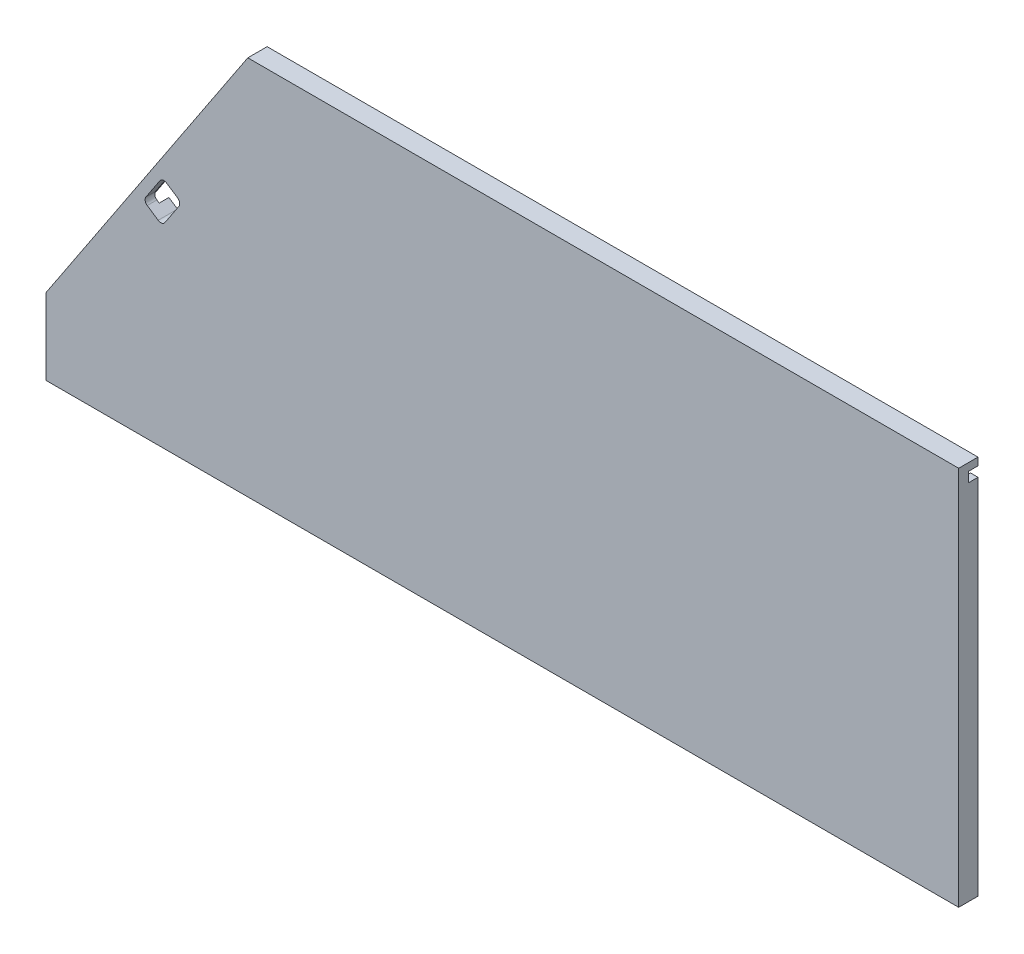
ISO-10303-21;
HEADER;
FILE_DESCRIPTION(('STEP AP214'),'2;1');
FILE_NAME('part.step','',(''),(''),'','','');
FILE_SCHEMA(('AUTOMOTIVE_DESIGN { 1 0 10303 214 1 1 1 1 }'));
ENDSEC;
DATA;
#1=APPLICATION_CONTEXT('core data for automotive mechanical design processes');
#2=APPLICATION_PROTOCOL_DEFINITION('international standard','automotive_design',2000,#1);
#3=PRODUCT_CONTEXT('',#1,'mechanical');
#4=PRODUCT('Part','Part','',(#3));
#5=PRODUCT_RELATED_PRODUCT_CATEGORY('part','',(#4));
#6=PRODUCT_DEFINITION_FORMATION('','',#4);
#7=PRODUCT_DEFINITION_CONTEXT('part definition',#1,'design');
#8=PRODUCT_DEFINITION('design','',#6,#7);
#9=PRODUCT_DEFINITION_SHAPE('','',#8);
#10=(LENGTH_UNIT() NAMED_UNIT(*) SI_UNIT(.MILLI.,.METRE.));
#11=(NAMED_UNIT(*) PLANE_ANGLE_UNIT() SI_UNIT($,.RADIAN.));
#12=(NAMED_UNIT(*) SI_UNIT($,.STERADIAN.) SOLID_ANGLE_UNIT());
#13=UNCERTAINTY_MEASURE_WITH_UNIT(LENGTH_MEASURE(1.E-05),#10,'distance_accuracy_value','');
#14=(GEOMETRIC_REPRESENTATION_CONTEXT(3) GLOBAL_UNCERTAINTY_ASSIGNED_CONTEXT((#13)) GLOBAL_UNIT_ASSIGNED_CONTEXT((#10,
#11,#12)) REPRESENTATION_CONTEXT('',''));
#15=CARTESIAN_POINT('',(0.,0.,0.));
#16=DIRECTION('',(0.,0.,1.));
#17=DIRECTION('',(1.,0.,0.));
#18=AXIS2_PLACEMENT_3D('',#15,#16,#17);
#19=CARTESIAN_POINT('',(-385.693130461073,212.808045977011,6.35));
#20=DIRECTION('',(0.833333333333333,-0.552770798392567,0.));
#21=DIRECTION('',(0.552770798392567,0.833333333333333,0.));
#22=AXIS2_PLACEMENT_3D('',#19,#20,#21);
#23=PLANE('',#22);
#24=DIRECTION('',(-0.552770798392567,-0.833333333333333,0.));
#25=VECTOR('',#24,1.);
#26=CARTESIAN_POINT('',(-385.693130461073,212.808045977011,6.35));
#27=LINE('',#26,#25);
#28=CARTESIAN_POINT('',(-456.447792655321,106.141379310345,6.35));
#29=VERTEX_POINT('',#28);
#30=CARTESIAN_POINT('',(-513.029885057471,20.8406655143671,6.35));
#31=VERTEX_POINT('',#30);
#32=EDGE_CURVE('E271',#29,#31,#27,.T.);
#33=ORIENTED_EDGE('',*,*,#32,.F.);
#34=DIRECTION('',(0.,0.,-1.));
#35=VECTOR('',#34,1.);
#36=CARTESIAN_POINT('',(-456.447792655321,106.141379310345,6.35));
#37=LINE('',#36,#35);
#38=CARTESIAN_POINT('',(-456.447792655321,106.141379310345,0.));
#39=VERTEX_POINT('',#38);
#40=EDGE_CURVE('E261',#29,#39,#37,.T.);
#41=ORIENTED_EDGE('',*,*,#40,.T.);
#42=DIRECTION('',(-0.552770798392567,-0.833333333333333,0.));
#43=VECTOR('',#42,1.);
#44=CARTESIAN_POINT('',(-385.693130461073,212.808045977011,0.));
#45=LINE('',#44,#43);
#46=CARTESIAN_POINT('',(-513.029885057471,20.8406655143671,0.));
#47=VERTEX_POINT('',#46);
#48=EDGE_CURVE('E266',#39,#47,#45,.T.);
#49=ORIENTED_EDGE('',*,*,#48,.T.);
#50=DIRECTION('',(0.,0.,-1.));
#51=VECTOR('',#50,1.);
#52=CARTESIAN_POINT('',(-513.029885057471,20.8406655143671,6.35));
#53=LINE('',#52,#51);
#54=EDGE_CURVE('E303',#31,#47,#53,.T.);
#55=ORIENTED_EDGE('',*,*,#54,.F.);
#56=EDGE_LOOP('',(#33,#41,#49,#55));
#57=FACE_BOUND('',#56,.T.);
#58=ADVANCED_FACE('F32',(#57),#23,.F.);
#59=CARTESIAN_POINT('',(0.,0.,0.));
#60=DIRECTION('',(0.,0.,1.));
#61=DIRECTION('',(1.,0.,0.));
#62=AXIS2_PLACEMENT_3D('',#59,#60,#61);
#63=PLANE('',#62);
#64=DIRECTION('',(0.,1.,0.));
#65=VECTOR('',#64,1.);
#66=CARTESIAN_POINT('',(75.4701149425288,-25.6919540229885,0.));
#67=LINE('',#66,#65);
#68=CARTESIAN_POINT('',(75.4701149425288,219.308045977011,0.));
#69=VERTEX_POINT('',#68);
#70=CARTESIAN_POINT('',(75.4701149425288,224.308045977011,0.));
#71=VERTEX_POINT('',#70);
#72=EDGE_CURVE('E358',#69,#71,#67,.T.);
#73=ORIENTED_EDGE('',*,*,#72,.F.);
#74=DIRECTION('',(-1.,0.,0.));
#75=VECTOR('',#74,1.);
#76=CARTESIAN_POINT('',(70.4701149425288,219.308045977011,0.));
#77=LINE('',#76,#75);
#78=CARTESIAN_POINT('',(-389.181518233611,219.308045977011,0.));
#79=VERTEX_POINT('',#78);
#80=EDGE_CURVE('E311',#69,#79,#77,.T.);
#81=ORIENTED_EDGE('',*,*,#80,.T.);
#82=DIRECTION('',(-0.552770798392567,-0.833333333333333,0.));
#83=VECTOR('',#82,1.);
#84=CARTESIAN_POINT('',(-389.181518233611,219.308045977011,0.));
#85=LINE('',#84,#83);
#86=CARTESIAN_POINT('',(-519.529885057471,22.8004892541227,0.));
#87=VERTEX_POINT('',#86);
#88=EDGE_CURVE('E306',#79,#87,#85,.T.);
#89=ORIENTED_EDGE('',*,*,#88,.T.);
#90=DIRECTION('',(0.,-1.,0.));
#91=VECTOR('',#90,1.);
#92=CARTESIAN_POINT('',(-519.529885057471,22.8004892541227,0.));
#93=LINE('',#92,#91);
#94=CARTESIAN_POINT('',(-519.529885057471,-20.6919540229885,0.));
#95=VERTEX_POINT('',#94);
#96=EDGE_CURVE('E321',#87,#95,#93,.T.);
#97=ORIENTED_EDGE('',*,*,#96,.T.);
#98=DIRECTION('',(1.,0.,0.));
#99=VECTOR('',#98,1.);
#100=CARTESIAN_POINT('',(-519.529885057471,-20.6919540229885,0.));
#101=LINE('',#100,#99);
#102=CARTESIAN_POINT('',(70.4701149425288,-20.6919540229885,0.));
#103=VERTEX_POINT('',#102);
#104=EDGE_CURVE('E324',#95,#103,#101,.T.);
#105=ORIENTED_EDGE('',*,*,#104,.T.);
#106=DIRECTION('',(0.,1.,0.));
#107=VECTOR('',#106,1.);
#108=CARTESIAN_POINT('',(70.4701149425288,-20.6919540229885,0.));
#109=LINE('',#108,#107);
#110=CARTESIAN_POINT('',(70.4701149425288,212.808045977011,0.));
#111=VERTEX_POINT('',#110);
#112=EDGE_CURVE('E327',#103,#111,#109,.T.);
#113=ORIENTED_EDGE('',*,*,#112,.T.);
#114=DIRECTION('',(-1.,0.,0.));
#115=VECTOR('',#114,1.);
#116=CARTESIAN_POINT('',(-19.1346419276526,212.808045977011,0.));
#117=LINE('',#116,#115);
#118=CARTESIAN_POINT('',(75.4701149425288,212.808045977011,0.));
#119=VERTEX_POINT('',#118);
#120=EDGE_CURVE('E47',#119,#111,#117,.T.);
#121=ORIENTED_EDGE('',*,*,#120,.F.);
#122=CARTESIAN_POINT('',(75.4701149425288,-25.6919540229885,0.));
#123=VERTEX_POINT('',#122);
#124=EDGE_CURVE('E233',#123,#119,#67,.T.);
#125=ORIENTED_EDGE('',*,*,#124,.F.);
#126=DIRECTION('',(1.,0.,0.));
#127=VECTOR('',#126,1.);
#128=CARTESIAN_POINT('',(-524.529885057471,-25.6919540229885,0.));
#129=LINE('',#128,#127);
#130=CARTESIAN_POINT('',(-524.529885057471,-25.6919540229885,0.));
#131=VERTEX_POINT('',#130);
#132=EDGE_CURVE('E356',#131,#123,#129,.T.);
#133=ORIENTED_EDGE('',*,*,#132,.F.);
#134=DIRECTION('',(0.,-1.,0.));
#135=VECTOR('',#134,1.);
#136=CARTESIAN_POINT('',(-524.529885057471,24.3080459770115,0.));
#137=LINE('',#136,#135);
#138=CARTESIAN_POINT('',(-524.529885057471,24.3080459770115,0.));
#139=VERTEX_POINT('',#138);
#140=EDGE_CURVE('E340',#139,#131,#137,.T.);
#141=ORIENTED_EDGE('',*,*,#140,.F.);
#142=DIRECTION('',(-0.552770798392567,-0.833333333333333,0.));
#143=VECTOR('',#142,1.);
#144=CARTESIAN_POINT('',(-391.864893443255,224.308045977011,0.));
#145=LINE('',#144,#143);
#146=CARTESIAN_POINT('',(-391.864893443255,224.308045977011,0.));
#147=VERTEX_POINT('',#146);
#148=EDGE_CURVE('E345',#147,#139,#145,.T.);
#149=ORIENTED_EDGE('',*,*,#148,.F.);
#150=DIRECTION('',(-1.,0.,0.));
#151=VECTOR('',#150,1.);
#152=CARTESIAN_POINT('',(75.4701149425288,224.308045977011,0.));
#153=LINE('',#152,#151);
#154=EDGE_CURVE('E360',#71,#147,#153,.T.);
#155=ORIENTED_EDGE('',*,*,#154,.F.);
#156=EDGE_LOOP('',(#73,#81,#89,#97,#105,#113,#121,#125,#133,#141,#149,#155));
#157=FACE_BOUND('',#156,.T.);
#158=ADVANCED_FACE('F491',(#157),#63,.F.);
#159=CARTESIAN_POINT('',(-524.529885057471,24.3080459770115,12.7));
#160=DIRECTION('',(1.,0.,0.));
#161=DIRECTION('',(0.,0.,-1.));
#162=AXIS2_PLACEMENT_3D('',#159,#160,#161);
#163=PLANE('',#162);
#164=ORIENTED_EDGE('',*,*,#140,.T.);
#165=DIRECTION('',(0.,0.,-1.));
#166=VECTOR('',#165,1.);
#167=CARTESIAN_POINT('',(-524.529885057471,-25.6919540229885,12.7));
#168=LINE('',#167,#166);
#169=CARTESIAN_POINT('',(-524.529885057471,-25.6919540229885,12.7));
#170=VERTEX_POINT('',#169);
#171=EDGE_CURVE('E373',#170,#131,#168,.T.);
#172=ORIENTED_EDGE('',*,*,#171,.F.);
#173=DIRECTION('',(0.,-1.,0.));
#174=VECTOR('',#173,1.);
#175=CARTESIAN_POINT('',(-524.529885057471,24.3080459770115,12.7));
#176=LINE('',#175,#174);
#177=CARTESIAN_POINT('',(-524.529885057471,24.3080459770115,12.7));
#178=VERTEX_POINT('',#177);
#179=EDGE_CURVE('E341',#178,#170,#176,.T.);
#180=ORIENTED_EDGE('',*,*,#179,.F.);
#181=DIRECTION('',(0.,0.,-1.));
#182=VECTOR('',#181,1.);
#183=CARTESIAN_POINT('',(-524.529885057471,24.3080459770115,12.7));
#184=LINE('',#183,#182);
#185=EDGE_CURVE('E353',#178,#139,#184,.T.);
#186=ORIENTED_EDGE('',*,*,#185,.T.);
#187=EDGE_LOOP('',(#164,#172,#180,#186));
#188=FACE_BOUND('',#187,.T.);
#189=ADVANCED_FACE('F495',(#188),#163,.F.);
#190=CARTESIAN_POINT('',(-524.529885057471,-25.6919540229885,12.7));
#191=DIRECTION('',(0.,1.,0.));
#192=DIRECTION('',(0.,0.,1.));
#193=AXIS2_PLACEMENT_3D('',#190,#191,#192);
#194=PLANE('',#193);
#195=ORIENTED_EDGE('',*,*,#132,.T.);
#196=DIRECTION('',(0.,0.,-1.));
#197=VECTOR('',#196,1.);
#198=CARTESIAN_POINT('',(75.4701149425288,-25.6919540229885,12.7));
#199=LINE('',#198,#197);
#200=CARTESIAN_POINT('',(75.4701149425288,-25.6919540229885,12.7));
#201=VERTEX_POINT('',#200);
#202=EDGE_CURVE('E371',#201,#123,#199,.T.);
#203=ORIENTED_EDGE('',*,*,#202,.F.);
#204=DIRECTION('',(1.,0.,0.));
#205=VECTOR('',#204,1.);
#206=CARTESIAN_POINT('',(-524.529885057471,-25.6919540229885,12.7));
#207=LINE('',#206,#205);
#208=EDGE_CURVE('E344',#170,#201,#207,.T.);
#209=ORIENTED_EDGE('',*,*,#208,.F.);
#210=ORIENTED_EDGE('',*,*,#171,.T.);
#211=EDGE_LOOP('',(#195,#203,#209,#210));
#212=FACE_BOUND('',#211,.T.);
#213=ADVANCED_FACE('F501',(#212),#194,.F.);
#214=CARTESIAN_POINT('',(75.4701149425288,-25.6919540229885,12.7));
#215=DIRECTION('',(-1.,0.,0.));
#216=DIRECTION('',(0.,0.,1.));
#217=AXIS2_PLACEMENT_3D('',#214,#215,#216);
#218=PLANE('',#217);
#219=DIRECTION('',(0.,1.,0.));
#220=VECTOR('',#219,1.);
#221=CARTESIAN_POINT('',(75.4701149425288,-25.6919540229885,6.35));
#222=LINE('',#221,#220);
#223=CARTESIAN_POINT('',(75.4701149425288,212.808045977011,6.34999999999999));
#224=VERTEX_POINT('',#223);
#225=CARTESIAN_POINT('',(75.4701149425288,219.308045977011,6.34999999999999));
#226=VERTEX_POINT('',#225);
#227=EDGE_CURVE('E210',#224,#226,#222,.T.);
#228=ORIENTED_EDGE('',*,*,#227,.T.);
#229=DIRECTION('',(0.,0.,-1.));
#230=VECTOR('',#229,1.);
#231=CARTESIAN_POINT('',(75.4701149425288,219.308045977011,12.7));
#232=LINE('',#231,#230);
#233=EDGE_CURVE('E223',#226,#69,#232,.T.);
#234=ORIENTED_EDGE('',*,*,#233,.T.);
#235=ORIENTED_EDGE('',*,*,#72,.T.);
#236=DIRECTION('',(0.,0.,-1.));
#237=VECTOR('',#236,1.);
#238=CARTESIAN_POINT('',(75.4701149425288,224.308045977011,12.7));
#239=LINE('',#238,#237);
#240=CARTESIAN_POINT('',(75.4701149425288,224.308045977011,12.7));
#241=VERTEX_POINT('',#240);
#242=EDGE_CURVE('E368',#241,#71,#239,.T.);
#243=ORIENTED_EDGE('',*,*,#242,.F.);
#244=DIRECTION('',(0.,1.,0.));
#245=VECTOR('',#244,1.);
#246=CARTESIAN_POINT('',(75.4701149425288,-25.6919540229885,12.7));
#247=LINE('',#246,#245);
#248=EDGE_CURVE('E347',#201,#241,#247,.T.);
#249=ORIENTED_EDGE('',*,*,#248,.F.);
#250=ORIENTED_EDGE('',*,*,#202,.T.);
#251=ORIENTED_EDGE('',*,*,#124,.T.);
#252=DIRECTION('',(0.,0.,1.));
#253=VECTOR('',#252,1.);
#254=CARTESIAN_POINT('',(75.4701149425288,212.808045977011,12.7));
#255=LINE('',#254,#253);
#256=EDGE_CURVE('E224',#119,#224,#255,.T.);
#257=ORIENTED_EDGE('',*,*,#256,.T.);
#258=EDGE_LOOP('',(#228,#234,#235,#243,#249,#250,#251,#257));
#259=FACE_BOUND('',#258,.T.);
#260=ADVANCED_FACE('F230',(#259),#218,.F.);
#261=CARTESIAN_POINT('',(75.4701149425288,224.308045977011,12.7));
#262=DIRECTION('',(0.,-1.,0.));
#263=DIRECTION('',(1.,0.,0.));
#264=AXIS2_PLACEMENT_3D('',#261,#262,#263);
#265=PLANE('',#264);
#266=ORIENTED_EDGE('',*,*,#154,.T.);
#267=DIRECTION('',(0.,0.,-1.));
#268=VECTOR('',#267,1.);
#269=CARTESIAN_POINT('',(-391.864893443255,224.308045977011,12.7));
#270=LINE('',#269,#268);
#271=CARTESIAN_POINT('',(-391.864893443255,224.308045977011,12.7));
#272=VERTEX_POINT('',#271);
#273=EDGE_CURVE('E365',#272,#147,#270,.T.);
#274=ORIENTED_EDGE('',*,*,#273,.F.);
#275=DIRECTION('',(-1.,0.,0.));
#276=VECTOR('',#275,1.);
#277=CARTESIAN_POINT('',(75.4701149425288,224.308045977011,12.7));
#278=LINE('',#277,#276);
#279=EDGE_CURVE('E349',#241,#272,#278,.T.);
#280=ORIENTED_EDGE('',*,*,#279,.F.);
#281=ORIENTED_EDGE('',*,*,#242,.T.);
#282=EDGE_LOOP('',(#266,#274,#280,#281));
#283=FACE_BOUND('',#282,.T.);
#284=ADVANCED_FACE('F630',(#283),#265,.F.);
#285=CARTESIAN_POINT('',(-391.864893443255,224.308045977011,12.7));
#286=DIRECTION('',(0.833333333333333,-0.552770798392567,0.));
#287=DIRECTION('',(0.552770798392567,0.833333333333333,0.));
#288=AXIS2_PLACEMENT_3D('',#285,#286,#287);
#289=PLANE('',#288);
#290=ORIENTED_EDGE('',*,*,#148,.T.);
#291=ORIENTED_EDGE('',*,*,#185,.F.);
#292=DIRECTION('',(-0.552770798392567,-0.833333333333333,0.));
#293=VECTOR('',#292,1.);
#294=CARTESIAN_POINT('',(-391.864893443255,224.308045977011,12.7));
#295=LINE('',#294,#293);
#296=EDGE_CURVE('E351',#272,#178,#295,.T.);
#297=ORIENTED_EDGE('',*,*,#296,.F.);
#298=ORIENTED_EDGE('',*,*,#273,.T.);
#299=EDGE_LOOP('',(#290,#291,#297,#298));
#300=FACE_BOUND('',#299,.T.);
#301=ADVANCED_FACE('F551',(#300),#289,.F.);
#302=CARTESIAN_POINT('',(0.,0.,12.7));
#303=DIRECTION('',(0.,0.,1.));
#304=DIRECTION('',(1.,0.,0.));
#305=AXIS2_PLACEMENT_3D('',#302,#303,#304);
#306=PLANE('',#305);
#307=DIRECTION('',(-0.833333333333332,0.552770798392568,0.));
#308=VECTOR('',#307,1.);
#309=CARTESIAN_POINT('',(-448.114459321988,100.613671326419,12.7));
#310=LINE('',#309,#308);
#311=CARTESIAN_POINT('',(-450.760292655321,102.368718611315,12.7));
#312=VERTEX_POINT('',#311);
#313=CARTESIAN_POINT('',(-457.968625988655,107.150186017411,12.7));
#314=VERTEX_POINT('',#313);
#315=EDGE_CURVE('E246',#312,#314,#310,.T.);
#316=ORIENTED_EDGE('',*,*,#315,.T.);
#317=CARTESIAN_POINT('',(-456.213578703758,109.796019350744,12.7));
#318=DIRECTION('',(0.,0.,1.));
#319=DIRECTION('',(1.,0.,0.));
#320=AXIS2_PLACEMENT_3D('',#317,#318,#319);
#321=CIRCLE('',#320,3.175);
#322=CARTESIAN_POINT('',(-458.859412037092,111.551066635641,12.7));
#323=VERTEX_POINT('',#322);
#324=EDGE_CURVE('E11',#314,#323,#321,.F.);
#325=ORIENTED_EDGE('',*,*,#324,.T.);
#326=DIRECTION('',(0.55277079839257,0.833333333333331,0.));
#327=VECTOR('',#326,1.);
#328=CARTESIAN_POINT('',(-447.900730958959,128.071899968974,12.7));
#329=LINE('',#328,#327);
#330=CARTESIAN_POINT('',(-449.655778243855,125.426066635641,12.7));
#331=VERTEX_POINT('',#330);
#332=EDGE_CURVE('E249',#323,#331,#329,.T.);
#333=ORIENTED_EDGE('',*,*,#332,.T.);
#334=CARTESIAN_POINT('',(-447.009944910522,123.671019350744,12.7));
#335=DIRECTION('',(0.,0.,1.));
#336=DIRECTION('',(1.,0.,0.));
#337=AXIS2_PLACEMENT_3D('',#334,#335,#336);
#338=CIRCLE('',#337,3.175);
#339=CARTESIAN_POINT('',(-445.254897625625,126.316852684078,12.7));
#340=VERTEX_POINT('',#339);
#341=EDGE_CURVE('E410',#331,#340,#338,.F.);
#342=ORIENTED_EDGE('',*,*,#341,.T.);
#343=DIRECTION('',(0.833333333333327,-0.552770798392576,0.));
#344=VECTOR('',#343,1.);
#345=CARTESIAN_POINT('',(-443.734064292292,125.308045977011,12.7));
#346=LINE('',#345,#344);
#347=CARTESIAN_POINT('',(-438.046564292292,121.535385277982,12.7));
#348=VERTEX_POINT('',#347);
#349=EDGE_CURVE('E239',#340,#348,#346,.T.);
#350=ORIENTED_EDGE('',*,*,#349,.T.);
#351=CARTESIAN_POINT('',(-439.801611577189,118.889551944649,12.7));
#352=DIRECTION('',(0.,0.,1.));
#353=DIRECTION('',(1.,0.,0.));
#354=AXIS2_PLACEMENT_3D('',#351,#352,#353);
#355=CIRCLE('',#354,3.175);
#356=CARTESIAN_POINT('',(-437.155778243855,117.134504659752,12.7));
#357=VERTEX_POINT('',#356);
#358=EDGE_CURVE('E402',#348,#357,#355,.F.);
#359=ORIENTED_EDGE('',*,*,#358,.T.);
#360=DIRECTION('',(-0.552770798392569,-0.833333333333332,0.));
#361=VECTOR('',#360,1.);
#362=CARTESIAN_POINT('',(-435.400730958959,119.780337993086,12.7));
#363=LINE('',#362,#361);
#364=CARTESIAN_POINT('',(-446.359412037092,103.259504659752,12.7));
#365=VERTEX_POINT('',#364);
#366=EDGE_CURVE('E242',#357,#365,#363,.T.);
#367=ORIENTED_EDGE('',*,*,#366,.T.);
#368=CARTESIAN_POINT('',(-449.005245370425,105.014551944649,12.7));
#369=DIRECTION('',(0.,0.,1.));
#370=DIRECTION('',(1.,0.,0.));
#371=AXIS2_PLACEMENT_3D('',#368,#369,#370);
#372=CIRCLE('',#371,3.175);
#373=EDGE_CURVE('E406',#365,#312,#372,.F.);
#374=ORIENTED_EDGE('',*,*,#373,.T.);
#375=EDGE_LOOP('',(#316,#325,#333,#342,#350,#359,#367,#374));
#376=FACE_BOUND('',#375,.T.);
#377=ORIENTED_EDGE('',*,*,#179,.T.);
#378=ORIENTED_EDGE('',*,*,#208,.T.);
#379=ORIENTED_EDGE('',*,*,#248,.T.);
#380=ORIENTED_EDGE('',*,*,#279,.T.);
#381=ORIENTED_EDGE('',*,*,#296,.T.);
#382=EDGE_LOOP('',(#377,#378,#379,#380,#381));
#383=FACE_BOUND('',#382,.T.);
#384=ADVANCED_FACE('F421',(#376,#383),#306,.T.);
#385=CARTESIAN_POINT('',(0.,0.,6.35));
#386=DIRECTION('',(0.,0.,1.));
#387=DIRECTION('',(1.,0.,0.));
#388=AXIS2_PLACEMENT_3D('',#385,#386,#387);
#389=PLANE('',#388);
#390=DIRECTION('',(-1.,0.,0.));
#391=VECTOR('',#390,1.);
#392=CARTESIAN_POINT('',(-19.1346419276526,212.808045977011,6.34999999999999));
#393=LINE('',#392,#391);
#394=CARTESIAN_POINT('',(70.4701149425288,212.808045977011,6.34999999999999));
#395=VERTEX_POINT('',#394);
#396=EDGE_CURVE('E215',#224,#395,#393,.T.);
#397=ORIENTED_EDGE('',*,*,#396,.T.);
#398=DIRECTION('',(0.,1.,0.));
#399=VECTOR('',#398,1.);
#400=CARTESIAN_POINT('',(70.4701149425288,-20.6919540229885,6.35));
#401=LINE('',#400,#399);
#402=CARTESIAN_POINT('',(70.4701149425288,-20.6919540229885,6.35));
#403=VERTEX_POINT('',#402);
#404=EDGE_CURVE('E315',#403,#395,#401,.T.);
#405=ORIENTED_EDGE('',*,*,#404,.F.);
#406=DIRECTION('',(1.,0.,0.));
#407=VECTOR('',#406,1.);
#408=CARTESIAN_POINT('',(-519.529885057471,-20.6919540229885,6.35));
#409=LINE('',#408,#407);
#410=CARTESIAN_POINT('',(-519.529885057471,-20.6919540229885,6.35));
#411=VERTEX_POINT('',#410);
#412=EDGE_CURVE('E313',#411,#403,#409,.T.);
#413=ORIENTED_EDGE('',*,*,#412,.F.);
#414=DIRECTION('',(0.,-1.,0.));
#415=VECTOR('',#414,1.);
#416=CARTESIAN_POINT('',(-519.529885057471,22.8004892541227,6.35));
#417=LINE('',#416,#415);
#418=CARTESIAN_POINT('',(-519.529885057471,22.8004892541227,6.35));
#419=VERTEX_POINT('',#418);
#420=EDGE_CURVE('E310',#419,#411,#417,.T.);
#421=ORIENTED_EDGE('',*,*,#420,.F.);
#422=DIRECTION('',(-0.552770798392567,-0.833333333333333,0.));
#423=VECTOR('',#422,1.);
#424=CARTESIAN_POINT('',(-389.181518233611,219.308045977011,6.35));
#425=LINE('',#424,#423);
#426=CARTESIAN_POINT('',(-389.181518233611,219.308045977011,6.35));
#427=VERTEX_POINT('',#426);
#428=EDGE_CURVE('E307',#427,#419,#425,.T.);
#429=ORIENTED_EDGE('',*,*,#428,.F.);
#430=DIRECTION('',(-1.,0.,0.));
#431=VECTOR('',#430,1.);
#432=CARTESIAN_POINT('',(70.4701149425288,219.308045977011,6.35));
#433=LINE('',#432,#431);
#434=EDGE_CURVE('E218',#226,#427,#433,.T.);
#435=ORIENTED_EDGE('',*,*,#434,.F.);
#436=ORIENTED_EDGE('',*,*,#227,.F.);
#437=EDGE_LOOP('',(#397,#405,#413,#421,#429,#435,#436));
#438=FACE_BOUND('',#437,.T.);
#439=DIRECTION('',(0.,1.,0.));
#440=VECTOR('',#439,1.);
#441=CARTESIAN_POINT('',(63.9701149425287,-14.1919540229885,6.35));
#442=LINE('',#441,#440);
#443=CARTESIAN_POINT('',(63.9701149425287,-14.1919540229885,6.35));
#444=VERTEX_POINT('',#443);
#445=CARTESIAN_POINT('',(63.9701149425287,212.808045977011,6.35));
#446=VERTEX_POINT('',#445);
#447=EDGE_CURVE('E275',#444,#446,#442,.T.);
#448=ORIENTED_EDGE('',*,*,#447,.T.);
#449=DIRECTION('',(-1.,0.,0.));
#450=VECTOR('',#449,1.);
#451=CARTESIAN_POINT('',(63.9701149425287,212.808045977011,6.35));
#452=LINE('',#451,#450);
#453=CARTESIAN_POINT('',(-385.693130461073,212.808045977011,6.35));
#454=VERTEX_POINT('',#453);
#455=EDGE_CURVE('E278',#446,#454,#452,.T.);
#456=ORIENTED_EDGE('',*,*,#455,.T.);
#457=CARTESIAN_POINT('',(-443.734064292292,125.308045977011,6.35));
#458=VERTEX_POINT('',#457);
#459=EDGE_CURVE('E267',#454,#458,#27,.T.);
#460=ORIENTED_EDGE('',*,*,#459,.T.);
#461=DIRECTION('',(-0.833333333333332,0.552770798392568,0.));
#462=VECTOR('',#461,1.);
#463=CARTESIAN_POINT('',(-77.8632180173191,-117.383217787767,6.35));
#464=LINE('',#463,#462);
#465=CARTESIAN_POINT('',(-445.254897625625,126.316852684078,6.35));
#466=VERTEX_POINT('',#465);
#467=EDGE_CURVE('E258',#458,#466,#464,.T.);
#468=ORIENTED_EDGE('',*,*,#467,.T.);
#469=CARTESIAN_POINT('',(-447.009944910522,123.671019350744,6.35));
#470=DIRECTION('',(0.,0.,1.));
#471=DIRECTION('',(1.,0.,0.));
#472=AXIS2_PLACEMENT_3D('',#469,#470,#471);
#473=CIRCLE('',#472,3.175);
#474=CARTESIAN_POINT('',(-449.655778243855,125.426066635641,6.35));
#475=VERTEX_POINT('',#474);
#476=EDGE_CURVE('E408',#466,#475,#473,.T.);
#477=ORIENTED_EDGE('',*,*,#476,.T.);
#478=DIRECTION('',(-0.55277079839257,-0.833333333333331,0.));
#479=VECTOR('',#478,1.);
#480=CARTESIAN_POINT('',(-370.037512941639,245.455117756741,6.35));
#481=LINE('',#480,#479);
#482=CARTESIAN_POINT('',(-458.859412037092,111.551066635641,6.35));
#483=VERTEX_POINT('',#482);
#484=EDGE_CURVE('E378',#475,#483,#481,.T.);
#485=ORIENTED_EDGE('',*,*,#484,.T.);
#486=CARTESIAN_POINT('',(-456.213578703758,109.796019350744,6.35));
#487=DIRECTION('',(0.,0.,1.));
#488=DIRECTION('',(1.,0.,0.));
#489=AXIS2_PLACEMENT_3D('',#486,#487,#488);
#490=CIRCLE('',#489,3.175);
#491=CARTESIAN_POINT('',(-457.968625988655,107.150186017411,6.35));
#492=VERTEX_POINT('',#491);
#493=EDGE_CURVE('E40',#483,#492,#490,.T.);
#494=ORIENTED_EDGE('',*,*,#493,.T.);
#495=DIRECTION('',(0.833333333333334,-0.552770798392566,0.));
#496=VECTOR('',#495,1.);
#497=CARTESIAN_POINT('',(-90.5769463803472,-136.549884454433,6.35));
#498=LINE('',#497,#496);
#499=EDGE_CURVE('E264',#492,#29,#498,.T.);
#500=ORIENTED_EDGE('',*,*,#499,.T.);
#501=ORIENTED_EDGE('',*,*,#32,.T.);
#502=DIRECTION('',(0.,-1.,0.));
#503=VECTOR('',#502,1.);
#504=CARTESIAN_POINT('',(-513.029885057471,20.8406655143671,6.35));
#505=LINE('',#504,#503);
#506=CARTESIAN_POINT('',(-513.029885057471,-14.1919540229885,6.35));
#507=VERTEX_POINT('',#506);
#508=EDGE_CURVE('E270',#31,#507,#505,.T.);
#509=ORIENTED_EDGE('',*,*,#508,.T.);
#510=DIRECTION('',(1.,0.,0.));
#511=VECTOR('',#510,1.);
#512=CARTESIAN_POINT('',(-513.029885057471,-14.1919540229885,6.35));
#513=LINE('',#512,#511);
#514=EDGE_CURVE('E273',#507,#444,#513,.T.);
#515=ORIENTED_EDGE('',*,*,#514,.T.);
#516=EDGE_LOOP('',(#448,#456,#460,#468,#477,#485,#494,#500,#501,#509,#515));
#517=FACE_BOUND('',#516,.T.);
#518=ADVANCED_FACE('F212',(#438,#517),#389,.F.);
#519=CARTESIAN_POINT('',(-389.181518233611,219.308045977011,6.35));
#520=DIRECTION('',(0.833333333333333,-0.552770798392567,0.));
#521=DIRECTION('',(0.552770798392567,0.833333333333333,0.));
#522=AXIS2_PLACEMENT_3D('',#519,#520,#521);
#523=PLANE('',#522);
#524=ORIENTED_EDGE('',*,*,#88,.F.);
#525=DIRECTION('',(0.,0.,-1.));
#526=VECTOR('',#525,1.);
#527=CARTESIAN_POINT('',(-389.181518233611,219.308045977011,6.35));
#528=LINE('',#527,#526);
#529=EDGE_CURVE('E318',#427,#79,#528,.T.);
#530=ORIENTED_EDGE('',*,*,#529,.F.);
#531=ORIENTED_EDGE('',*,*,#428,.T.);
#532=DIRECTION('',(0.,0.,-1.));
#533=VECTOR('',#532,1.);
#534=CARTESIAN_POINT('',(-519.529885057471,22.8004892541227,6.35));
#535=LINE('',#534,#533);
#536=EDGE_CURVE('E337',#419,#87,#535,.T.);
#537=ORIENTED_EDGE('',*,*,#536,.T.);
#538=EDGE_LOOP('',(#524,#530,#531,#537));
#539=FACE_BOUND('',#538,.T.);
#540=ADVANCED_FACE('F641',(#539),#523,.T.);
#541=CARTESIAN_POINT('',(-519.529885057471,22.8004892541227,6.35));
#542=DIRECTION('',(1.,0.,0.));
#543=DIRECTION('',(0.,0.,-1.));
#544=AXIS2_PLACEMENT_3D('',#541,#542,#543);
#545=PLANE('',#544);
#546=ORIENTED_EDGE('',*,*,#96,.F.);
#547=ORIENTED_EDGE('',*,*,#536,.F.);
#548=ORIENTED_EDGE('',*,*,#420,.T.);
#549=DIRECTION('',(0.,0.,-1.));
#550=VECTOR('',#549,1.);
#551=CARTESIAN_POINT('',(-519.529885057471,-20.6919540229885,6.35));
#552=LINE('',#551,#550);
#553=EDGE_CURVE('E335',#411,#95,#552,.T.);
#554=ORIENTED_EDGE('',*,*,#553,.T.);
#555=EDGE_LOOP('',(#546,#547,#548,#554));
#556=FACE_BOUND('',#555,.T.);
#557=ADVANCED_FACE('F681',(#556),#545,.T.);
#558=CARTESIAN_POINT('',(-519.529885057471,-20.6919540229885,6.35));
#559=DIRECTION('',(0.,1.,0.));
#560=DIRECTION('',(0.,0.,1.));
#561=AXIS2_PLACEMENT_3D('',#558,#559,#560);
#562=PLANE('',#561);
#563=ORIENTED_EDGE('',*,*,#104,.F.);
#564=ORIENTED_EDGE('',*,*,#553,.F.);
#565=ORIENTED_EDGE('',*,*,#412,.T.);
#566=DIRECTION('',(0.,0.,-1.));
#567=VECTOR('',#566,1.);
#568=CARTESIAN_POINT('',(70.4701149425288,-20.6919540229885,6.35));
#569=LINE('',#568,#567);
#570=EDGE_CURVE('E333',#403,#103,#569,.T.);
#571=ORIENTED_EDGE('',*,*,#570,.T.);
#572=EDGE_LOOP('',(#563,#564,#565,#571));
#573=FACE_BOUND('',#572,.T.);
#574=ADVANCED_FACE('F651',(#573),#562,.T.);
#575=CARTESIAN_POINT('',(70.4701149425288,-20.6919540229885,6.35));
#576=DIRECTION('',(-1.,0.,0.));
#577=DIRECTION('',(0.,0.,1.));
#578=AXIS2_PLACEMENT_3D('',#575,#576,#577);
#579=PLANE('',#578);
#580=DIRECTION('',(0.,0.,1.));
#581=VECTOR('',#580,1.);
#582=CARTESIAN_POINT('',(70.4701149425288,212.808045977011,6.35));
#583=LINE('',#582,#581);
#584=EDGE_CURVE('E227',#111,#395,#583,.T.);
#585=ORIENTED_EDGE('',*,*,#584,.F.);
#586=ORIENTED_EDGE('',*,*,#112,.F.);
#587=ORIENTED_EDGE('',*,*,#570,.F.);
#588=ORIENTED_EDGE('',*,*,#404,.T.);
#589=EDGE_LOOP('',(#585,#586,#587,#588));
#590=FACE_BOUND('',#589,.T.);
#591=ADVANCED_FACE('F486',(#590),#579,.T.);
#592=CARTESIAN_POINT('',(70.4701149425288,219.308045977011,6.35));
#593=DIRECTION('',(0.,-1.,0.));
#594=DIRECTION('',(1.,0.,0.));
#595=AXIS2_PLACEMENT_3D('',#592,#593,#594);
#596=PLANE('',#595);
#597=ORIENTED_EDGE('',*,*,#529,.T.);
#598=ORIENTED_EDGE('',*,*,#80,.F.);
#599=ORIENTED_EDGE('',*,*,#233,.F.);
#600=ORIENTED_EDGE('',*,*,#434,.T.);
#601=EDGE_LOOP('',(#597,#598,#599,#600));
#602=FACE_BOUND('',#601,.T.);
#603=ADVANCED_FACE('F479',(#602),#596,.T.);
#604=CARTESIAN_POINT('',(-385.693130461073,212.808045977011,0.));
#605=VERTEX_POINT('',#604);
#606=CARTESIAN_POINT('',(-443.734064292292,125.308045977011,0.));
#607=VERTEX_POINT('',#606);
#608=EDGE_CURVE('E281',#605,#607,#45,.T.);
#609=ORIENTED_EDGE('',*,*,#608,.T.);
#610=DIRECTION('',(0.,0.,1.));
#611=VECTOR('',#610,1.);
#612=CARTESIAN_POINT('',(-443.734064292292,125.308045977011,6.35));
#613=LINE('',#612,#611);
#614=EDGE_CURVE('E252',#607,#458,#613,.T.);
#615=ORIENTED_EDGE('',*,*,#614,.T.);
#616=ORIENTED_EDGE('',*,*,#459,.F.);
#617=DIRECTION('',(0.,0.,-1.));
#618=VECTOR('',#617,1.);
#619=CARTESIAN_POINT('',(-385.693130461073,212.808045977011,6.35));
#620=LINE('',#619,#618);
#621=EDGE_CURVE('E280',#454,#605,#620,.T.);
#622=ORIENTED_EDGE('',*,*,#621,.T.);
#623=EDGE_LOOP('',(#609,#615,#616,#622));
#624=FACE_BOUND('',#623,.T.);
#625=ADVANCED_FACE('F476',(#624),#23,.F.);
#626=CARTESIAN_POINT('',(-513.029885057471,20.8406655143671,6.35));
#627=DIRECTION('',(1.,0.,0.));
#628=DIRECTION('',(0.,0.,-1.));
#629=AXIS2_PLACEMENT_3D('',#626,#627,#628);
#630=PLANE('',#629);
#631=DIRECTION('',(0.,-1.,0.));
#632=VECTOR('',#631,1.);
#633=CARTESIAN_POINT('',(-513.029885057471,20.8406655143671,0.));
#634=LINE('',#633,#632);
#635=CARTESIAN_POINT('',(-513.029885057471,-14.1919540229885,0.));
#636=VERTEX_POINT('',#635);
#637=EDGE_CURVE('E284',#47,#636,#634,.T.);
#638=ORIENTED_EDGE('',*,*,#637,.T.);
#639=DIRECTION('',(0.,0.,-1.));
#640=VECTOR('',#639,1.);
#641=CARTESIAN_POINT('',(-513.029885057471,-14.1919540229885,6.35));
#642=LINE('',#641,#640);
#643=EDGE_CURVE('E301',#507,#636,#642,.T.);
#644=ORIENTED_EDGE('',*,*,#643,.F.);
#645=ORIENTED_EDGE('',*,*,#508,.F.);
#646=ORIENTED_EDGE('',*,*,#54,.T.);
#647=EDGE_LOOP('',(#638,#644,#645,#646));
#648=FACE_BOUND('',#647,.T.);
#649=ADVANCED_FACE('F459',(#648),#630,.F.);
#650=CARTESIAN_POINT('',(-513.029885057471,-14.1919540229885,6.35));
#651=DIRECTION('',(0.,1.,0.));
#652=DIRECTION('',(-1.,0.,0.));
#653=AXIS2_PLACEMENT_3D('',#650,#651,#652);
#654=PLANE('',#653);
#655=DIRECTION('',(1.,0.,0.));
#656=VECTOR('',#655,1.);
#657=CARTESIAN_POINT('',(-513.029885057471,-14.1919540229885,0.));
#658=LINE('',#657,#656);
#659=CARTESIAN_POINT('',(63.9701149425287,-14.1919540229885,0.));
#660=VERTEX_POINT('',#659);
#661=EDGE_CURVE('E287',#636,#660,#658,.T.);
#662=ORIENTED_EDGE('',*,*,#661,.T.);
#663=DIRECTION('',(0.,0.,-1.));
#664=VECTOR('',#663,1.);
#665=CARTESIAN_POINT('',(63.9701149425287,-14.1919540229885,6.35));
#666=LINE('',#665,#664);
#667=EDGE_CURVE('E299',#444,#660,#666,.T.);
#668=ORIENTED_EDGE('',*,*,#667,.F.);
#669=ORIENTED_EDGE('',*,*,#514,.F.);
#670=ORIENTED_EDGE('',*,*,#643,.T.);
#671=EDGE_LOOP('',(#662,#668,#669,#670));
#672=FACE_BOUND('',#671,.T.);
#673=ADVANCED_FACE('F466',(#672),#654,.F.);
#674=CARTESIAN_POINT('',(63.9701149425287,-14.1919540229885,6.35));
#675=DIRECTION('',(-1.,0.,0.));
#676=DIRECTION('',(0.,0.,1.));
#677=AXIS2_PLACEMENT_3D('',#674,#675,#676);
#678=PLANE('',#677);
#679=DIRECTION('',(0.,1.,0.));
#680=VECTOR('',#679,1.);
#681=CARTESIAN_POINT('',(63.9701149425287,-14.1919540229885,0.));
#682=LINE('',#681,#680);
#683=CARTESIAN_POINT('',(63.9701149425287,212.808045977011,0.));
#684=VERTEX_POINT('',#683);
#685=EDGE_CURVE('E290',#660,#684,#682,.T.);
#686=ORIENTED_EDGE('',*,*,#685,.T.);
#687=DIRECTION('',(0.,0.,-1.));
#688=VECTOR('',#687,1.);
#689=CARTESIAN_POINT('',(63.9701149425287,212.808045977011,6.35));
#690=LINE('',#689,#688);
#691=EDGE_CURVE('E296',#446,#684,#690,.T.);
#692=ORIENTED_EDGE('',*,*,#691,.F.);
#693=ORIENTED_EDGE('',*,*,#447,.F.);
#694=ORIENTED_EDGE('',*,*,#667,.T.);
#695=EDGE_LOOP('',(#686,#692,#693,#694));
#696=FACE_BOUND('',#695,.T.);
#697=ADVANCED_FACE('F469',(#696),#678,.F.);
#698=CARTESIAN_POINT('',(63.9701149425287,212.808045977011,6.35));
#699=DIRECTION('',(0.,-1.,0.));
#700=DIRECTION('',(1.,0.,0.));
#701=AXIS2_PLACEMENT_3D('',#698,#699,#700);
#702=PLANE('',#701);
#703=ORIENTED_EDGE('',*,*,#621,.F.);
#704=ORIENTED_EDGE('',*,*,#455,.F.);
#705=ORIENTED_EDGE('',*,*,#691,.T.);
#706=DIRECTION('',(-1.,0.,0.));
#707=VECTOR('',#706,1.);
#708=CARTESIAN_POINT('',(63.9701149425287,212.808045977011,0.));
#709=LINE('',#708,#707);
#710=EDGE_CURVE('E292',#684,#605,#709,.T.);
#711=ORIENTED_EDGE('',*,*,#710,.T.);
#712=EDGE_LOOP('',(#703,#704,#705,#711));
#713=FACE_BOUND('',#712,.T.);
#714=ADVANCED_FACE('F473',(#713),#702,.F.);
#715=ORIENTED_EDGE('',*,*,#48,.F.);
#716=DIRECTION('',(-0.833333333333334,0.552770798392566,0.));
#717=VECTOR('',#716,1.);
#718=CARTESIAN_POINT('',(-460.614459321988,108.905233302308,0.));
#719=LINE('',#718,#717);
#720=CARTESIAN_POINT('',(-450.760292655321,102.368718611315,0.));
#721=VERTEX_POINT('',#720);
#722=EDGE_CURVE('E243',#721,#39,#719,.T.);
#723=ORIENTED_EDGE('',*,*,#722,.F.);
#724=CARTESIAN_POINT('',(-449.005245370425,105.014551944649,0.));
#725=DIRECTION('',(0.,0.,1.));
#726=DIRECTION('',(1.,0.,0.));
#727=AXIS2_PLACEMENT_3D('',#724,#725,#726);
#728=CIRCLE('',#727,3.175);
#729=CARTESIAN_POINT('',(-446.359412037092,103.259504659752,0.));
#730=VERTEX_POINT('',#729);
#731=EDGE_CURVE('E404',#721,#730,#728,.T.);
#732=ORIENTED_EDGE('',*,*,#731,.T.);
#733=DIRECTION('',(-0.552770798392569,-0.833333333333332,0.));
#734=VECTOR('',#733,1.);
#735=CARTESIAN_POINT('',(-435.400730958959,119.780337993086,0.));
#736=LINE('',#735,#734);
#737=CARTESIAN_POINT('',(-437.155778243855,117.134504659752,0.));
#738=VERTEX_POINT('',#737);
#739=EDGE_CURVE('E238',#738,#730,#736,.T.);
#740=ORIENTED_EDGE('',*,*,#739,.F.);
#741=CARTESIAN_POINT('',(-439.801611577189,118.889551944649,0.));
#742=DIRECTION('',(0.,0.,1.));
#743=DIRECTION('',(1.,0.,0.));
#744=AXIS2_PLACEMENT_3D('',#741,#742,#743);
#745=CIRCLE('',#744,3.175);
#746=CARTESIAN_POINT('',(-438.046564292292,121.535385277982,0.));
#747=VERTEX_POINT('',#746);
#748=EDGE_CURVE('E400',#738,#747,#745,.T.);
#749=ORIENTED_EDGE('',*,*,#748,.T.);
#750=DIRECTION('',(-0.833333333333332,0.552770798392568,0.));
#751=VECTOR('',#750,1.);
#752=CARTESIAN_POINT('',(-77.8632180173191,-117.383217787767,0.));
#753=LINE('',#752,#751);
#754=EDGE_CURVE('E376',#747,#607,#753,.T.);
#755=ORIENTED_EDGE('',*,*,#754,.T.);
#756=ORIENTED_EDGE('',*,*,#608,.F.);
#757=ORIENTED_EDGE('',*,*,#710,.F.);
#758=ORIENTED_EDGE('',*,*,#685,.F.);
#759=ORIENTED_EDGE('',*,*,#661,.F.);
#760=ORIENTED_EDGE('',*,*,#637,.F.);
#761=EDGE_LOOP('',(#715,#723,#732,#740,#749,#755,#756,#757,#758,#759,#760));
#762=FACE_BOUND('',#761,.T.);
#763=ADVANCED_FACE('F452',(#762),#63,.F.);
#764=CARTESIAN_POINT('',(-447.900730958959,128.071899968974,12.7));
#765=DIRECTION('',(-0.833333333333331,0.55277079839257,0.));
#766=DIRECTION('',(-0.55277079839257,-0.833333333333331,0.));
#767=AXIS2_PLACEMENT_3D('',#764,#765,#766);
#768=PLANE('',#767);
#769=ORIENTED_EDGE('',*,*,#484,.F.);
#770=DIRECTION('',(0.,0.,-1.));
#771=VECTOR('',#770,1.);
#772=CARTESIAN_POINT('',(-449.655778243855,125.426066635641,12.7));
#773=LINE('',#772,#771);
#774=EDGE_CURVE('E398',#475,#331,#773,.F.);
#775=ORIENTED_EDGE('',*,*,#774,.T.);
#776=ORIENTED_EDGE('',*,*,#332,.F.);
#777=DIRECTION('',(0.,0.,-1.));
#778=VECTOR('',#777,1.);
#779=CARTESIAN_POINT('',(-458.859412037092,111.551066635641,6.35));
#780=LINE('',#779,#778);
#781=EDGE_CURVE('E396',#323,#483,#780,.T.);
#782=ORIENTED_EDGE('',*,*,#781,.T.);
#783=EDGE_LOOP('',(#769,#775,#776,#782));
#784=FACE_BOUND('',#783,.T.);
#785=ADVANCED_FACE('F425',(#784),#768,.F.);
#786=CARTESIAN_POINT('',(-460.614459321988,108.905233302308,12.7));
#787=DIRECTION('',(-0.552770798392566,-0.833333333333334,0.));
#788=DIRECTION('',(0.833333333333334,-0.552770798392566,0.));
#789=AXIS2_PLACEMENT_3D('',#786,#787,#788);
#790=PLANE('',#789);
#791=ORIENTED_EDGE('',*,*,#315,.F.);
#792=DIRECTION('',(0.,0.,-1.));
#793=VECTOR('',#792,1.);
#794=CARTESIAN_POINT('',(-450.760292655321,102.368718611315,0.));
#795=LINE('',#794,#793);
#796=EDGE_CURVE('E393',#312,#721,#795,.T.);
#797=ORIENTED_EDGE('',*,*,#796,.T.);
#798=ORIENTED_EDGE('',*,*,#722,.T.);
#799=ORIENTED_EDGE('',*,*,#40,.F.);
#800=ORIENTED_EDGE('',*,*,#499,.F.);
#801=DIRECTION('',(0.,0.,-1.));
#802=VECTOR('',#801,1.);
#803=CARTESIAN_POINT('',(-457.968625988655,107.150186017411,12.7));
#804=LINE('',#803,#802);
#805=EDGE_CURVE('E391',#492,#314,#804,.F.);
#806=ORIENTED_EDGE('',*,*,#805,.T.);
#807=EDGE_LOOP('',(#791,#797,#798,#799,#800,#806));
#808=FACE_BOUND('',#807,.T.);
#809=ADVANCED_FACE('F416',(#808),#790,.F.);
#810=CARTESIAN_POINT('',(-443.734064292292,125.308045977011,12.7));
#811=DIRECTION('',(0.552770798392568,0.833333333333332,0.));
#812=DIRECTION('',(-0.833333333333332,0.552770798392568,0.));
#813=AXIS2_PLACEMENT_3D('',#810,#811,#812);
#814=PLANE('',#813);
#815=ORIENTED_EDGE('',*,*,#754,.F.);
#816=DIRECTION('',(0.,0.,-1.));
#817=VECTOR('',#816,1.);
#818=CARTESIAN_POINT('',(-438.046564292292,121.535385277982,12.7));
#819=LINE('',#818,#817);
#820=EDGE_CURVE('E389',#747,#348,#819,.F.);
#821=ORIENTED_EDGE('',*,*,#820,.T.);
#822=ORIENTED_EDGE('',*,*,#349,.F.);
#823=DIRECTION('',(0.,0.,-1.));
#824=VECTOR('',#823,1.);
#825=CARTESIAN_POINT('',(-445.254897625625,126.316852684078,6.35));
#826=LINE('',#825,#824);
#827=EDGE_CURVE('E386',#340,#466,#826,.T.);
#828=ORIENTED_EDGE('',*,*,#827,.T.);
#829=ORIENTED_EDGE('',*,*,#467,.F.);
#830=ORIENTED_EDGE('',*,*,#614,.F.);
#831=EDGE_LOOP('',(#815,#821,#822,#828,#829,#830));
#832=FACE_BOUND('',#831,.T.);
#833=ADVANCED_FACE('F434',(#832),#814,.F.);
#834=CARTESIAN_POINT('',(-435.400730958959,119.780337993086,12.7));
#835=DIRECTION('',(0.833333333333332,-0.552770798392569,0.));
#836=DIRECTION('',(0.552770798392569,0.833333333333332,0.));
#837=AXIS2_PLACEMENT_3D('',#834,#835,#836);
#838=PLANE('',#837);
#839=ORIENTED_EDGE('',*,*,#366,.F.);
#840=DIRECTION('',(0.,0.,-1.));
#841=VECTOR('',#840,1.);
#842=CARTESIAN_POINT('',(-437.155778243855,117.134504659752,0.));
#843=LINE('',#842,#841);
#844=EDGE_CURVE('E383',#357,#738,#843,.T.);
#845=ORIENTED_EDGE('',*,*,#844,.T.);
#846=ORIENTED_EDGE('',*,*,#739,.T.);
#847=DIRECTION('',(0.,0.,-1.));
#848=VECTOR('',#847,1.);
#849=CARTESIAN_POINT('',(-446.359412037092,103.259504659752,12.7));
#850=LINE('',#849,#848);
#851=EDGE_CURVE('E381',#730,#365,#850,.F.);
#852=ORIENTED_EDGE('',*,*,#851,.T.);
#853=EDGE_LOOP('',(#839,#845,#846,#852));
#854=FACE_BOUND('',#853,.T.);
#855=ADVANCED_FACE('F443',(#854),#838,.F.);
#856=CARTESIAN_POINT('',(-439.801611577189,118.889551944649,12.7));
#857=DIRECTION('',(0.,0.,1.));
#858=DIRECTION('',(1.,0.,0.));
#859=AXIS2_PLACEMENT_3D('',#856,#857,#858);
#860=CYLINDRICAL_SURFACE('',#859,3.175);
#861=ORIENTED_EDGE('',*,*,#358,.F.);
#862=ORIENTED_EDGE('',*,*,#820,.F.);
#863=ORIENTED_EDGE('',*,*,#748,.F.);
#864=ORIENTED_EDGE('',*,*,#844,.F.);
#865=EDGE_LOOP('',(#861,#862,#863,#864));
#866=FACE_BOUND('',#865,.T.);
#867=ADVANCED_FACE('F438',(#866),#860,.F.);
#868=CARTESIAN_POINT('',(-449.005245370425,105.014551944649,12.7));
#869=DIRECTION('',(0.,0.,1.));
#870=DIRECTION('',(1.,0.,0.));
#871=AXIS2_PLACEMENT_3D('',#868,#869,#870);
#872=CYLINDRICAL_SURFACE('',#871,3.175);
#873=ORIENTED_EDGE('',*,*,#373,.F.);
#874=ORIENTED_EDGE('',*,*,#851,.F.);
#875=ORIENTED_EDGE('',*,*,#731,.F.);
#876=ORIENTED_EDGE('',*,*,#796,.F.);
#877=EDGE_LOOP('',(#873,#874,#875,#876));
#878=FACE_BOUND('',#877,.T.);
#879=ADVANCED_FACE('F447',(#878),#872,.F.);
#880=CARTESIAN_POINT('',(-447.009944910522,123.671019350744,12.7));
#881=DIRECTION('',(0.,0.,1.));
#882=DIRECTION('',(1.,0.,0.));
#883=AXIS2_PLACEMENT_3D('',#880,#881,#882);
#884=CYLINDRICAL_SURFACE('',#883,3.175);
#885=ORIENTED_EDGE('',*,*,#341,.F.);
#886=ORIENTED_EDGE('',*,*,#774,.F.);
#887=ORIENTED_EDGE('',*,*,#476,.F.);
#888=ORIENTED_EDGE('',*,*,#827,.F.);
#889=EDGE_LOOP('',(#885,#886,#887,#888));
#890=FACE_BOUND('',#889,.T.);
#891=ADVANCED_FACE('F428',(#890),#884,.F.);
#892=CARTESIAN_POINT('',(-456.213578703758,109.796019350744,12.7));
#893=DIRECTION('',(0.,0.,1.));
#894=DIRECTION('',(1.,0.,0.));
#895=AXIS2_PLACEMENT_3D('',#892,#893,#894);
#896=CYLINDRICAL_SURFACE('',#895,3.175);
#897=ORIENTED_EDGE('',*,*,#324,.F.);
#898=ORIENTED_EDGE('',*,*,#805,.F.);
#899=ORIENTED_EDGE('',*,*,#493,.F.);
#900=ORIENTED_EDGE('',*,*,#781,.F.);
#901=EDGE_LOOP('',(#897,#898,#899,#900));
#902=FACE_BOUND('',#901,.T.);
#903=ADVANCED_FACE('F34',(#902),#896,.F.);
#904=CARTESIAN_POINT('',(-19.1346419276526,212.808045977011,117.05909699184));
#905=DIRECTION('',(0.,-1.,0.));
#906=DIRECTION('',(0.,0.,-1.));
#907=AXIS2_PLACEMENT_3D('',#904,#905,#906);
#908=PLANE('',#907);
#909=ORIENTED_EDGE('',*,*,#120,.T.);
#910=ORIENTED_EDGE('',*,*,#584,.T.);
#911=ORIENTED_EDGE('',*,*,#396,.F.);
#912=ORIENTED_EDGE('',*,*,#256,.F.);
#913=EDGE_LOOP('',(#909,#910,#911,#912));
#914=FACE_BOUND('',#913,.T.);
#915=ADVANCED_FACE('F226',(#914),#908,.F.);
#916=CLOSED_SHELL('',(#58,#158,#189,#213,#260,#284,#301,#384,#518,#540,#557,#574,#591,#603,#625,
#649,#673,#697,#714,#763,#785,#809,#833,#855,#867,#879,#891,#903,#915));
#917=MANIFOLD_SOLID_BREP('B2',#916);
#918=ADVANCED_BREP_SHAPE_REPRESENTATION('',(#18,#917),#14);
#919=SHAPE_DEFINITION_REPRESENTATION(#9,#918);
ENDSEC;
END-ISO-10303-21;
